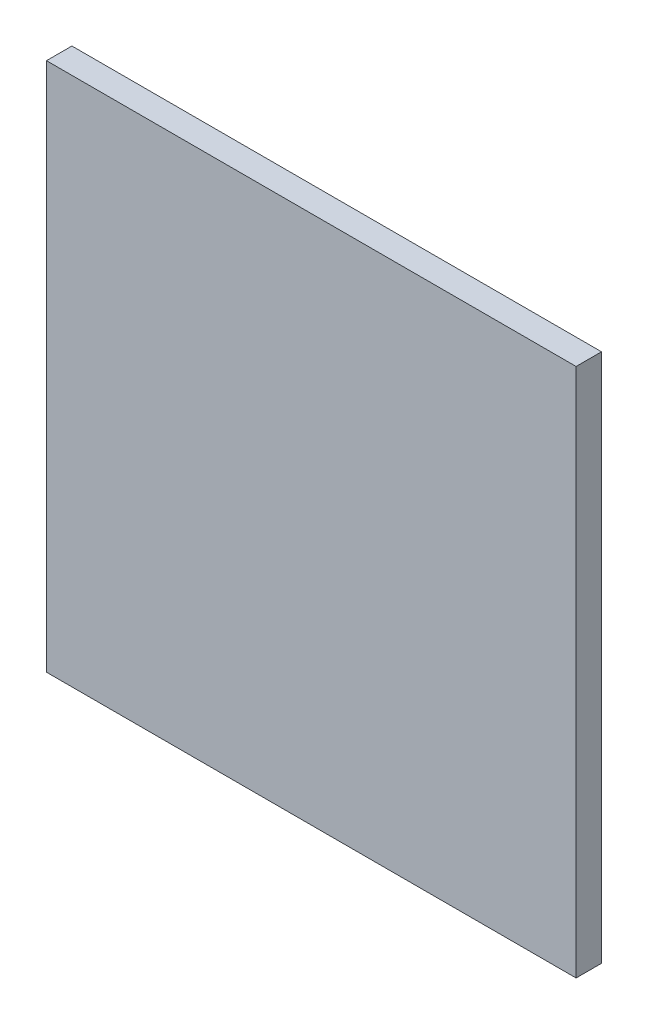
ISO-10303-21;
HEADER;
FILE_DESCRIPTION(('STEP AP214'),'2;1');
FILE_NAME('part.step','',(''),(''),'','','');
FILE_SCHEMA(('AUTOMOTIVE_DESIGN { 1 0 10303 214 1 1 1 1 }'));
ENDSEC;
DATA;
#1=APPLICATION_CONTEXT('core data for automotive mechanical design processes');
#2=APPLICATION_PROTOCOL_DEFINITION('international standard','automotive_design',2000,#1);
#3=PRODUCT_CONTEXT('',#1,'mechanical');
#4=PRODUCT('Part','Part','',(#3));
#5=PRODUCT_RELATED_PRODUCT_CATEGORY('part','',(#4));
#6=PRODUCT_DEFINITION_FORMATION('','',#4);
#7=PRODUCT_DEFINITION_CONTEXT('part definition',#1,'design');
#8=PRODUCT_DEFINITION('design','',#6,#7);
#9=PRODUCT_DEFINITION_SHAPE('','',#8);
#10=(LENGTH_UNIT() NAMED_UNIT(*) SI_UNIT(.MILLI.,.METRE.));
#11=(NAMED_UNIT(*) PLANE_ANGLE_UNIT() SI_UNIT($,.RADIAN.));
#12=(NAMED_UNIT(*) SI_UNIT($,.STERADIAN.) SOLID_ANGLE_UNIT());
#13=UNCERTAINTY_MEASURE_WITH_UNIT(LENGTH_MEASURE(1.E-05),#10,'distance_accuracy_value','');
#14=(GEOMETRIC_REPRESENTATION_CONTEXT(3) GLOBAL_UNCERTAINTY_ASSIGNED_CONTEXT((#13)) GLOBAL_UNIT_ASSIGNED_CONTEXT((#10,
#11,#12)) REPRESENTATION_CONTEXT('',''));
#15=CARTESIAN_POINT('',(0.,0.,0.));
#16=DIRECTION('',(0.,0.,1.));
#17=DIRECTION('',(1.,0.,0.));
#18=AXIS2_PLACEMENT_3D('',#15,#16,#17);
#19=CARTESIAN_POINT('',(0.,0.,6.));
#20=DIRECTION('',(-1.,0.,0.));
#21=DIRECTION('',(0.,0.,1.));
#22=AXIS2_PLACEMENT_3D('',#19,#20,#21);
#23=PLANE('',#22);
#24=DIRECTION('',(0.,1.,0.));
#25=VECTOR('',#24,1.);
#26=CARTESIAN_POINT('',(0.,0.,0.));
#27=LINE('',#26,#25);
#28=CARTESIAN_POINT('',(0.,0.,0.));
#29=VERTEX_POINT('',#28);
#30=CARTESIAN_POINT('',(0.,125.,0.));
#31=VERTEX_POINT('',#30);
#32=EDGE_CURVE('E97',#29,#31,#27,.T.);
#33=ORIENTED_EDGE('',*,*,#32,.F.);
#34=DIRECTION('',(0.,0.,-1.));
#35=VECTOR('',#34,1.);
#36=CARTESIAN_POINT('',(0.,0.,6.));
#37=LINE('',#36,#35);
#38=CARTESIAN_POINT('',(0.,0.,6.));
#39=VERTEX_POINT('',#38);
#40=EDGE_CURVE('E11',#39,#29,#37,.T.);
#41=ORIENTED_EDGE('',*,*,#40,.F.);
#42=DIRECTION('',(0.,1.,0.));
#43=VECTOR('',#42,1.);
#44=CARTESIAN_POINT('',(0.,0.,6.));
#45=LINE('',#44,#43);
#46=CARTESIAN_POINT('',(0.,125.,6.));
#47=VERTEX_POINT('',#46);
#48=EDGE_CURVE('E92',#39,#47,#45,.T.);
#49=ORIENTED_EDGE('',*,*,#48,.T.);
#50=DIRECTION('',(0.,0.,-1.));
#51=VECTOR('',#50,1.);
#52=CARTESIAN_POINT('',(0.,125.,6.));
#53=LINE('',#52,#51);
#54=EDGE_CURVE('E35',#47,#31,#53,.T.);
#55=ORIENTED_EDGE('',*,*,#54,.T.);
#56=EDGE_LOOP('',(#33,#41,#49,#55));
#57=FACE_BOUND('',#56,.T.);
#58=ADVANCED_FACE('F32',(#57),#23,.T.);
#59=CARTESIAN_POINT('',(0.,0.,6.));
#60=DIRECTION('',(0.,1.,0.));
#61=DIRECTION('',(0.,0.,1.));
#62=AXIS2_PLACEMENT_3D('',#59,#60,#61);
#63=PLANE('',#62);
#64=DIRECTION('',(1.,0.,0.));
#65=VECTOR('',#64,1.);
#66=CARTESIAN_POINT('',(0.,0.,0.));
#67=LINE('',#66,#65);
#68=CARTESIAN_POINT('',(125.,0.,0.));
#69=VERTEX_POINT('',#68);
#70=EDGE_CURVE('E65',#29,#69,#67,.T.);
#71=ORIENTED_EDGE('',*,*,#70,.T.);
#72=DIRECTION('',(0.,0.,-1.));
#73=VECTOR('',#72,1.);
#74=CARTESIAN_POINT('',(125.,0.,6.));
#75=LINE('',#74,#73);
#76=CARTESIAN_POINT('',(125.,0.,6.));
#77=VERTEX_POINT('',#76);
#78=EDGE_CURVE('E41',#77,#69,#75,.T.);
#79=ORIENTED_EDGE('',*,*,#78,.F.);
#80=DIRECTION('',(1.,0.,0.));
#81=VECTOR('',#80,1.);
#82=CARTESIAN_POINT('',(0.,0.,6.));
#83=LINE('',#82,#81);
#84=EDGE_CURVE('E82',#39,#77,#83,.T.);
#85=ORIENTED_EDGE('',*,*,#84,.F.);
#86=ORIENTED_EDGE('',*,*,#40,.T.);
#87=EDGE_LOOP('',(#71,#79,#85,#86));
#88=FACE_BOUND('',#87,.T.);
#89=ADVANCED_FACE('F107',(#88),#63,.F.);
#90=CARTESIAN_POINT('',(125.,0.,6.));
#91=DIRECTION('',(-1.,0.,0.));
#92=DIRECTION('',(0.,0.,1.));
#93=AXIS2_PLACEMENT_3D('',#90,#91,#92);
#94=PLANE('',#93);
#95=DIRECTION('',(0.,1.,0.));
#96=VECTOR('',#95,1.);
#97=CARTESIAN_POINT('',(125.,0.,0.));
#98=LINE('',#97,#96);
#99=CARTESIAN_POINT('',(125.,125.,0.));
#100=VERTEX_POINT('',#99);
#101=EDGE_CURVE('E89',#69,#100,#98,.T.);
#102=ORIENTED_EDGE('',*,*,#101,.T.);
#103=DIRECTION('',(0.,0.,-1.));
#104=VECTOR('',#103,1.);
#105=CARTESIAN_POINT('',(125.,125.,6.));
#106=LINE('',#105,#104);
#107=CARTESIAN_POINT('',(125.,125.,6.));
#108=VERTEX_POINT('',#107);
#109=EDGE_CURVE('E86',#108,#100,#106,.T.);
#110=ORIENTED_EDGE('',*,*,#109,.F.);
#111=DIRECTION('',(0.,1.,0.));
#112=VECTOR('',#111,1.);
#113=CARTESIAN_POINT('',(125.,0.,6.));
#114=LINE('',#113,#112);
#115=EDGE_CURVE('E77',#77,#108,#114,.T.);
#116=ORIENTED_EDGE('',*,*,#115,.F.);
#117=ORIENTED_EDGE('',*,*,#78,.T.);
#118=EDGE_LOOP('',(#102,#110,#116,#117));
#119=FACE_BOUND('',#118,.T.);
#120=ADVANCED_FACE('F87',(#119),#94,.F.);
#121=CARTESIAN_POINT('',(0.,125.,6.));
#122=DIRECTION('',(0.,1.,0.));
#123=DIRECTION('',(0.,0.,1.));
#124=AXIS2_PLACEMENT_3D('',#121,#122,#123);
#125=PLANE('',#124);
#126=DIRECTION('',(1.,0.,0.));
#127=VECTOR('',#126,1.);
#128=CARTESIAN_POINT('',(0.,125.,0.));
#129=LINE('',#128,#127);
#130=EDGE_CURVE('E100',#31,#100,#129,.T.);
#131=ORIENTED_EDGE('',*,*,#130,.F.);
#132=ORIENTED_EDGE('',*,*,#54,.F.);
#133=DIRECTION('',(1.,0.,0.));
#134=VECTOR('',#133,1.);
#135=CARTESIAN_POINT('',(0.,125.,6.));
#136=LINE('',#135,#134);
#137=EDGE_CURVE('E81',#47,#108,#136,.T.);
#138=ORIENTED_EDGE('',*,*,#137,.T.);
#139=ORIENTED_EDGE('',*,*,#109,.T.);
#140=EDGE_LOOP('',(#131,#132,#138,#139));
#141=FACE_BOUND('',#140,.T.);
#142=ADVANCED_FACE('F91',(#141),#125,.T.);
#143=CARTESIAN_POINT('',(0.,0.,6.));
#144=DIRECTION('',(0.,0.,-1.));
#145=DIRECTION('',(-1.,0.,0.));
#146=AXIS2_PLACEMENT_3D('',#143,#144,#145);
#147=PLANE('',#146);
#148=ORIENTED_EDGE('',*,*,#48,.F.);
#149=ORIENTED_EDGE('',*,*,#84,.T.);
#150=ORIENTED_EDGE('',*,*,#115,.T.);
#151=ORIENTED_EDGE('',*,*,#137,.F.);
#152=EDGE_LOOP('',(#148,#149,#150,#151));
#153=FACE_BOUND('',#152,.T.);
#154=ADVANCED_FACE('F80',(#153),#147,.F.);
#155=CARTESIAN_POINT('',(0.,0.,0.));
#156=DIRECTION('',(0.,0.,-1.));
#157=DIRECTION('',(-1.,0.,0.));
#158=AXIS2_PLACEMENT_3D('',#155,#156,#157);
#159=PLANE('',#158);
#160=ORIENTED_EDGE('',*,*,#32,.T.);
#161=ORIENTED_EDGE('',*,*,#130,.T.);
#162=ORIENTED_EDGE('',*,*,#101,.F.);
#163=ORIENTED_EDGE('',*,*,#70,.F.);
#164=EDGE_LOOP('',(#160,#161,#162,#163));
#165=FACE_BOUND('',#164,.T.);
#166=ADVANCED_FACE('F105',(#165),#159,.T.);
#167=CLOSED_SHELL('',(#58,#89,#120,#142,#154,#166));
#168=MANIFOLD_SOLID_BREP('B2',#167);
#169=ADVANCED_BREP_SHAPE_REPRESENTATION('',(#18,#168),#14);
#170=SHAPE_DEFINITION_REPRESENTATION(#9,#169);
ENDSEC;
END-ISO-10303-21;
